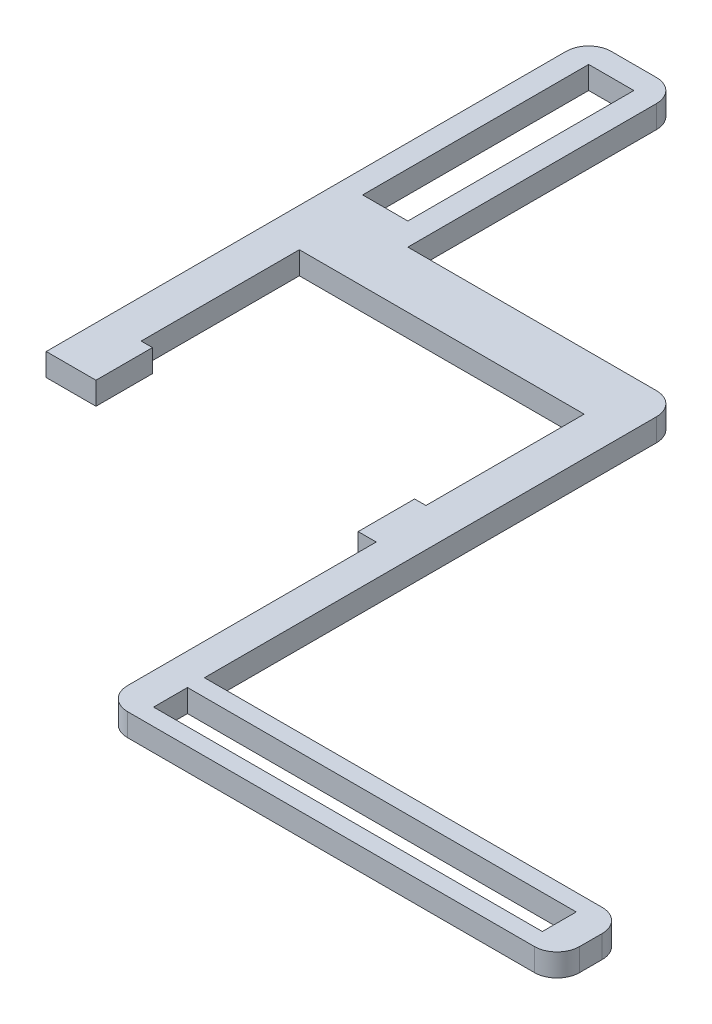
ISO-10303-21;
HEADER;
FILE_DESCRIPTION(('STEP AP214'),'2;1');
FILE_NAME('part.step','',(''),(''),'','','');
FILE_SCHEMA(('AUTOMOTIVE_DESIGN { 1 0 10303 214 1 1 1 1 }'));
ENDSEC;
DATA;
#1=APPLICATION_CONTEXT('core data for automotive mechanical design processes');
#2=APPLICATION_PROTOCOL_DEFINITION('international standard','automotive_design',2000,#1);
#3=PRODUCT_CONTEXT('',#1,'mechanical');
#4=PRODUCT('Part','Part','',(#3));
#5=PRODUCT_RELATED_PRODUCT_CATEGORY('part','',(#4));
#6=PRODUCT_DEFINITION_FORMATION('','',#4);
#7=PRODUCT_DEFINITION_CONTEXT('part definition',#1,'design');
#8=PRODUCT_DEFINITION('design','',#6,#7);
#9=PRODUCT_DEFINITION_SHAPE('','',#8);
#10=(LENGTH_UNIT() NAMED_UNIT(*) SI_UNIT(.MILLI.,.METRE.));
#11=(NAMED_UNIT(*) PLANE_ANGLE_UNIT() SI_UNIT($,.RADIAN.));
#12=(NAMED_UNIT(*) SI_UNIT($,.STERADIAN.) SOLID_ANGLE_UNIT());
#13=UNCERTAINTY_MEASURE_WITH_UNIT(LENGTH_MEASURE(1.E-05),#10,'distance_accuracy_value','');
#14=(GEOMETRIC_REPRESENTATION_CONTEXT(3) GLOBAL_UNCERTAINTY_ASSIGNED_CONTEXT((#13)) GLOBAL_UNIT_ASSIGNED_CONTEXT((#10,
#11,#12)) REPRESENTATION_CONTEXT('',''));
#15=CARTESIAN_POINT('',(0.,0.,0.));
#16=DIRECTION('',(0.,0.,1.));
#17=DIRECTION('',(1.,0.,0.));
#18=AXIS2_PLACEMENT_3D('',#15,#16,#17);
#19=CARTESIAN_POINT('',(0.,5.,-90.));
#20=DIRECTION('',(0.,0.,-1.));
#21=DIRECTION('',(-1.,0.,0.));
#22=AXIS2_PLACEMENT_3D('',#19,#20,#21);
#23=PLANE('',#22);
#24=DIRECTION('',(1.,0.,0.));
#25=VECTOR('',#24,1.);
#26=CARTESIAN_POINT('',(0.,5.,-90.));
#27=LINE('',#26,#25);
#28=CARTESIAN_POINT('',(-35.,5.,-90.));
#29=VERTEX_POINT('',#28);
#30=CARTESIAN_POINT('',(-25.,5.,-90.));
#31=VERTEX_POINT('',#30);
#32=EDGE_CURVE('E452',#29,#31,#27,.T.);
#33=ORIENTED_EDGE('',*,*,#32,.T.);
#34=DIRECTION('',(0.,-1.,0.));
#35=VECTOR('',#34,1.);
#36=CARTESIAN_POINT('',(-25.,0.,-90.));
#37=LINE('',#36,#35);
#38=CARTESIAN_POINT('',(-25.,0.,-90.));
#39=VERTEX_POINT('',#38);
#40=EDGE_CURVE('E636',#31,#39,#37,.T.);
#41=ORIENTED_EDGE('',*,*,#40,.T.);
#42=DIRECTION('',(1.,0.,0.));
#43=VECTOR('',#42,1.);
#44=CARTESIAN_POINT('',(0.,0.,-90.));
#45=LINE('',#44,#43);
#46=CARTESIAN_POINT('',(-35.,0.,-90.));
#47=VERTEX_POINT('',#46);
#48=EDGE_CURVE('E410',#47,#39,#45,.T.);
#49=ORIENTED_EDGE('',*,*,#48,.F.);
#50=DIRECTION('',(0.,-1.,0.));
#51=VECTOR('',#50,1.);
#52=CARTESIAN_POINT('',(-35.,5.,-90.));
#53=LINE('',#52,#51);
#54=EDGE_CURVE('E633',#47,#29,#53,.F.);
#55=ORIENTED_EDGE('',*,*,#54,.T.);
#56=EDGE_LOOP('',(#33,#41,#49,#55));
#57=FACE_BOUND('',#56,.T.);
#58=ADVANCED_FACE('F101',(#57),#23,.T.);
#59=CARTESIAN_POINT('',(-20.,5.,0.));
#60=DIRECTION('',(-1.,0.,0.));
#61=DIRECTION('',(0.,0.,1.));
#62=AXIS2_PLACEMENT_3D('',#59,#60,#61);
#63=PLANE('',#62);
#64=DIRECTION('',(0.,0.,-1.));
#65=VECTOR('',#64,1.);
#66=CARTESIAN_POINT('',(-20.,0.,0.));
#67=LINE('',#66,#65);
#68=CARTESIAN_POINT('',(-20.,0.,-30.));
#69=VERTEX_POINT('',#68);
#70=CARTESIAN_POINT('',(-20.,0.,-85.));
#71=VERTEX_POINT('',#70);
#72=EDGE_CURVE('E502',#69,#71,#67,.T.);
#73=ORIENTED_EDGE('',*,*,#72,.T.);
#74=DIRECTION('',(0.,-1.,0.));
#75=VECTOR('',#74,1.);
#76=CARTESIAN_POINT('',(-20.,5.,-85.));
#77=LINE('',#76,#75);
#78=CARTESIAN_POINT('',(-20.,5.,-85.));
#79=VERTEX_POINT('',#78);
#80=EDGE_CURVE('E110',#71,#79,#77,.F.);
#81=ORIENTED_EDGE('',*,*,#80,.T.);
#82=DIRECTION('',(0.,0.,-1.));
#83=VECTOR('',#82,1.);
#84=CARTESIAN_POINT('',(-20.,5.,0.));
#85=LINE('',#84,#83);
#86=CARTESIAN_POINT('',(-20.,5.,-30.));
#87=VERTEX_POINT('',#86);
#88=EDGE_CURVE('E448',#87,#79,#85,.T.);
#89=ORIENTED_EDGE('',*,*,#88,.F.);
#90=DIRECTION('',(0.,-1.,0.));
#91=VECTOR('',#90,1.);
#92=CARTESIAN_POINT('',(-20.,5.,-30.));
#93=LINE('',#92,#91);
#94=EDGE_CURVE('E456',#87,#69,#93,.T.);
#95=ORIENTED_EDGE('',*,*,#94,.T.);
#96=EDGE_LOOP('',(#73,#81,#89,#95));
#97=FACE_BOUND('',#96,.T.);
#98=ADVANCED_FACE('F643',(#97),#63,.F.);
#99=CARTESIAN_POINT('',(29.,5.,0.));
#100=DIRECTION('',(1.,0.,0.));
#101=DIRECTION('',(0.,0.,-1.));
#102=AXIS2_PLACEMENT_3D('',#99,#100,#101);
#103=PLANE('',#102);
#104=DIRECTION('',(0.,0.,1.));
#105=VECTOR('',#104,1.);
#106=CARTESIAN_POINT('',(29.,0.,0.));
#107=LINE('',#106,#105);
#108=CARTESIAN_POINT('',(29.,0.,17.5));
#109=VERTEX_POINT('',#108);
#110=CARTESIAN_POINT('',(29.,0.,30.));
#111=VERTEX_POINT('',#110);
#112=EDGE_CURVE('E487',#109,#111,#107,.T.);
#113=ORIENTED_EDGE('',*,*,#112,.T.);
#114=DIRECTION('',(0.,-1.,0.));
#115=VECTOR('',#114,1.);
#116=CARTESIAN_POINT('',(29.,5.,30.));
#117=LINE('',#116,#115);
#118=CARTESIAN_POINT('',(29.,5.,30.));
#119=VERTEX_POINT('',#118);
#120=EDGE_CURVE('E518',#119,#111,#117,.T.);
#121=ORIENTED_EDGE('',*,*,#120,.F.);
#122=DIRECTION('',(0.,0.,1.));
#123=VECTOR('',#122,1.);
#124=CARTESIAN_POINT('',(29.,5.,0.));
#125=LINE('',#124,#123);
#126=CARTESIAN_POINT('',(29.,5.,17.5));
#127=VERTEX_POINT('',#126);
#128=EDGE_CURVE('E433',#127,#119,#125,.T.);
#129=ORIENTED_EDGE('',*,*,#128,.F.);
#130=DIRECTION('',(0.,-1.,0.));
#131=VECTOR('',#130,1.);
#132=CARTESIAN_POINT('',(29.,5.,17.5));
#133=LINE('',#132,#131);
#134=EDGE_CURVE('E522',#127,#109,#133,.T.);
#135=ORIENTED_EDGE('',*,*,#134,.T.);
#136=EDGE_LOOP('',(#113,#121,#129,#135));
#137=FACE_BOUND('',#136,.T.);
#138=ADVANCED_FACE('F707',(#137),#103,.F.);
#139=CARTESIAN_POINT('',(0.,5.,17.5));
#140=DIRECTION('',(0.,0.,-1.));
#141=DIRECTION('',(-1.,0.,0.));
#142=AXIS2_PLACEMENT_3D('',#139,#140,#141);
#143=PLANE('',#142);
#144=DIRECTION('',(1.,0.,0.));
#145=VECTOR('',#144,1.);
#146=CARTESIAN_POINT('',(0.,0.,17.5));
#147=LINE('',#146,#145);
#148=CARTESIAN_POINT('',(31.5,0.,17.5));
#149=VERTEX_POINT('',#148);
#150=EDGE_CURVE('E476',#109,#149,#147,.T.);
#151=ORIENTED_EDGE('',*,*,#150,.F.);
#152=ORIENTED_EDGE('',*,*,#134,.F.);
#153=DIRECTION('',(1.,0.,0.));
#154=VECTOR('',#153,1.);
#155=CARTESIAN_POINT('',(0.,5.,17.5));
#156=LINE('',#155,#154);
#157=CARTESIAN_POINT('',(31.5,5.,17.5));
#158=VERTEX_POINT('',#157);
#159=EDGE_CURVE('E423',#127,#158,#156,.T.);
#160=ORIENTED_EDGE('',*,*,#159,.T.);
#161=DIRECTION('',(0.,-1.,0.));
#162=VECTOR('',#161,1.);
#163=CARTESIAN_POINT('',(31.5,5.,17.5));
#164=LINE('',#163,#162);
#165=EDGE_CURVE('E525',#158,#149,#164,.T.);
#166=ORIENTED_EDGE('',*,*,#165,.T.);
#167=EDGE_LOOP('',(#151,#152,#160,#166));
#168=FACE_BOUND('',#167,.T.);
#169=ADVANCED_FACE('F695',(#168),#143,.T.);
#170=CARTESIAN_POINT('',(31.5,5.,0.));
#171=DIRECTION('',(-1.,0.,0.));
#172=DIRECTION('',(0.,0.,1.));
#173=AXIS2_PLACEMENT_3D('',#170,#171,#172);
#174=PLANE('',#173);
#175=DIRECTION('',(0.,0.,-1.));
#176=VECTOR('',#175,1.);
#177=CARTESIAN_POINT('',(31.5,0.,0.));
#178=LINE('',#177,#176);
#179=CARTESIAN_POINT('',(31.5,0.,-17.5));
#180=VERTEX_POINT('',#179);
#181=EDGE_CURVE('E483',#149,#180,#178,.T.);
#182=ORIENTED_EDGE('',*,*,#181,.F.);
#183=ORIENTED_EDGE('',*,*,#165,.F.);
#184=DIRECTION('',(0.,0.,-1.));
#185=VECTOR('',#184,1.);
#186=CARTESIAN_POINT('',(31.5,5.,0.));
#187=LINE('',#186,#185);
#188=CARTESIAN_POINT('',(31.5,5.,-17.5));
#189=VERTEX_POINT('',#188);
#190=EDGE_CURVE('E429',#158,#189,#187,.T.);
#191=ORIENTED_EDGE('',*,*,#190,.T.);
#192=DIRECTION('',(0.,-1.,0.));
#193=VECTOR('',#192,1.);
#194=CARTESIAN_POINT('',(31.5,5.,-17.5));
#195=LINE('',#194,#193);
#196=EDGE_CURVE('E528',#189,#180,#195,.T.);
#197=ORIENTED_EDGE('',*,*,#196,.T.);
#198=EDGE_LOOP('',(#182,#183,#191,#197));
#199=FACE_BOUND('',#198,.T.);
#200=ADVANCED_FACE('F690',(#199),#174,.T.);
#201=CARTESIAN_POINT('',(0.,5.,-17.5));
#202=DIRECTION('',(0.,0.,-1.));
#203=DIRECTION('',(-1.,0.,0.));
#204=AXIS2_PLACEMENT_3D('',#201,#202,#203);
#205=PLANE('',#204);
#206=DIRECTION('',(1.,0.,0.));
#207=VECTOR('',#206,1.);
#208=CARTESIAN_POINT('',(0.,0.,-17.5));
#209=LINE('',#208,#207);
#210=CARTESIAN_POINT('',(-31.5,0.,-17.5));
#211=VERTEX_POINT('',#210);
#212=EDGE_CURVE('E479',#211,#180,#209,.T.);
#213=ORIENTED_EDGE('',*,*,#212,.T.);
#214=ORIENTED_EDGE('',*,*,#196,.F.);
#215=DIRECTION('',(1.,0.,0.));
#216=VECTOR('',#215,1.);
#217=CARTESIAN_POINT('',(0.,5.,-17.5));
#218=LINE('',#217,#216);
#219=CARTESIAN_POINT('',(-31.5,5.,-17.5));
#220=VERTEX_POINT('',#219);
#221=EDGE_CURVE('E426',#220,#189,#218,.T.);
#222=ORIENTED_EDGE('',*,*,#221,.F.);
#223=DIRECTION('',(0.,-1.,0.));
#224=VECTOR('',#223,1.);
#225=CARTESIAN_POINT('',(-31.5,5.,-17.5));
#226=LINE('',#225,#224);
#227=EDGE_CURVE('E531',#220,#211,#226,.T.);
#228=ORIENTED_EDGE('',*,*,#227,.T.);
#229=EDGE_LOOP('',(#213,#214,#222,#228));
#230=FACE_BOUND('',#229,.T.);
#231=ADVANCED_FACE('F687',(#230),#205,.F.);
#232=CARTESIAN_POINT('',(-31.5,5.,0.));
#233=DIRECTION('',(-1.,0.,0.));
#234=DIRECTION('',(0.,0.,1.));
#235=AXIS2_PLACEMENT_3D('',#232,#233,#234);
#236=PLANE('',#235);
#237=DIRECTION('',(0.,0.,-1.));
#238=VECTOR('',#237,1.);
#239=CARTESIAN_POINT('',(-31.5,0.,0.));
#240=LINE('',#239,#238);
#241=CARTESIAN_POINT('',(-31.5,0.,17.5));
#242=VERTEX_POINT('',#241);
#243=EDGE_CURVE('E475',#242,#211,#240,.T.);
#244=ORIENTED_EDGE('',*,*,#243,.T.);
#245=ORIENTED_EDGE('',*,*,#227,.F.);
#246=DIRECTION('',(0.,0.,-1.));
#247=VECTOR('',#246,1.);
#248=CARTESIAN_POINT('',(-31.5,5.,0.));
#249=LINE('',#248,#247);
#250=CARTESIAN_POINT('',(-31.5,5.,17.5));
#251=VERTEX_POINT('',#250);
#252=EDGE_CURVE('E422',#251,#220,#249,.T.);
#253=ORIENTED_EDGE('',*,*,#252,.F.);
#254=DIRECTION('',(0.,-1.,0.));
#255=VECTOR('',#254,1.);
#256=CARTESIAN_POINT('',(-31.5,5.,17.5));
#257=LINE('',#256,#255);
#258=EDGE_CURVE('E535',#251,#242,#257,.T.);
#259=ORIENTED_EDGE('',*,*,#258,.T.);
#260=EDGE_LOOP('',(#244,#245,#253,#259));
#261=FACE_BOUND('',#260,.T.);
#262=ADVANCED_FACE('F683',(#261),#236,.F.);
#263=CARTESIAN_POINT('',(-29.,0.,17.5));
#264=VERTEX_POINT('',#263);
#265=EDGE_CURVE('E471',#242,#264,#147,.T.);
#266=ORIENTED_EDGE('',*,*,#265,.F.);
#267=ORIENTED_EDGE('',*,*,#258,.F.);
#268=CARTESIAN_POINT('',(-29.,5.,17.5));
#269=VERTEX_POINT('',#268);
#270=EDGE_CURVE('E418',#251,#269,#156,.T.);
#271=ORIENTED_EDGE('',*,*,#270,.T.);
#272=DIRECTION('',(0.,-1.,0.));
#273=VECTOR('',#272,1.);
#274=CARTESIAN_POINT('',(-29.,5.,17.5));
#275=LINE('',#274,#273);
#276=EDGE_CURVE('E538',#269,#264,#275,.T.);
#277=ORIENTED_EDGE('',*,*,#276,.T.);
#278=EDGE_LOOP('',(#266,#267,#271,#277));
#279=FACE_BOUND('',#278,.T.);
#280=ADVANCED_FACE('F676',(#279),#143,.T.);
#281=CARTESIAN_POINT('',(-29.,5.,0.));
#282=DIRECTION('',(1.,0.,0.));
#283=DIRECTION('',(0.,0.,-1.));
#284=AXIS2_PLACEMENT_3D('',#281,#282,#283);
#285=PLANE('',#284);
#286=DIRECTION('',(0.,0.,1.));
#287=VECTOR('',#286,1.);
#288=CARTESIAN_POINT('',(-29.,0.,0.));
#289=LINE('',#288,#287);
#290=CARTESIAN_POINT('',(-29.,0.,30.));
#291=VERTEX_POINT('',#290);
#292=EDGE_CURVE('E466',#264,#291,#289,.T.);
#293=ORIENTED_EDGE('',*,*,#292,.F.);
#294=ORIENTED_EDGE('',*,*,#276,.F.);
#295=DIRECTION('',(0.,0.,1.));
#296=VECTOR('',#295,1.);
#297=CARTESIAN_POINT('',(-29.,5.,0.));
#298=LINE('',#297,#296);
#299=CARTESIAN_POINT('',(-29.,5.,30.));
#300=VERTEX_POINT('',#299);
#301=EDGE_CURVE('E413',#269,#300,#298,.T.);
#302=ORIENTED_EDGE('',*,*,#301,.T.);
#303=DIRECTION('',(0.,-1.,0.));
#304=VECTOR('',#303,1.);
#305=CARTESIAN_POINT('',(-29.,5.,30.));
#306=LINE('',#305,#304);
#307=EDGE_CURVE('E541',#300,#291,#306,.T.);
#308=ORIENTED_EDGE('',*,*,#307,.T.);
#309=EDGE_LOOP('',(#293,#294,#302,#308));
#310=FACE_BOUND('',#309,.T.);
#311=ADVANCED_FACE('F673',(#310),#285,.T.);
#312=CARTESIAN_POINT('',(0.,5.,30.));
#313=DIRECTION('',(0.,0.,-1.));
#314=DIRECTION('',(-1.,0.,0.));
#315=AXIS2_PLACEMENT_3D('',#312,#313,#314);
#316=PLANE('',#315);
#317=DIRECTION('',(1.,0.,0.));
#318=VECTOR('',#317,1.);
#319=CARTESIAN_POINT('',(0.,0.,30.));
#320=LINE('',#319,#318);
#321=CARTESIAN_POINT('',(-40.,0.,30.));
#322=VERTEX_POINT('',#321);
#323=EDGE_CURVE('E461',#322,#291,#320,.T.);
#324=ORIENTED_EDGE('',*,*,#323,.T.);
#325=ORIENTED_EDGE('',*,*,#307,.F.);
#326=DIRECTION('',(1.,0.,0.));
#327=VECTOR('',#326,1.);
#328=CARTESIAN_POINT('',(0.,5.,30.));
#329=LINE('',#328,#327);
#330=CARTESIAN_POINT('',(-40.,5.,30.));
#331=VERTEX_POINT('',#330);
#332=EDGE_CURVE('E409',#331,#300,#329,.T.);
#333=ORIENTED_EDGE('',*,*,#332,.F.);
#334=DIRECTION('',(0.,-1.,0.));
#335=VECTOR('',#334,1.);
#336=CARTESIAN_POINT('',(-40.,5.,30.));
#337=LINE('',#336,#335);
#338=EDGE_CURVE('E544',#331,#322,#337,.T.);
#339=ORIENTED_EDGE('',*,*,#338,.T.);
#340=EDGE_LOOP('',(#324,#325,#333,#339));
#341=FACE_BOUND('',#340,.T.);
#342=ADVANCED_FACE('F670',(#341),#316,.F.);
#343=CARTESIAN_POINT('',(-40.,5.,0.));
#344=DIRECTION('',(-1.,0.,0.));
#345=DIRECTION('',(0.,0.,1.));
#346=AXIS2_PLACEMENT_3D('',#343,#344,#345);
#347=PLANE('',#346);
#348=DIRECTION('',(0.,0.,-1.));
#349=VECTOR('',#348,1.);
#350=CARTESIAN_POINT('',(-40.,5.,0.));
#351=LINE('',#350,#349);
#352=CARTESIAN_POINT('',(-40.,5.,-85.));
#353=VERTEX_POINT('',#352);
#354=EDGE_CURVE('E405',#331,#353,#351,.T.);
#355=ORIENTED_EDGE('',*,*,#354,.T.);
#356=DIRECTION('',(0.,-1.,0.));
#357=VECTOR('',#356,1.);
#358=CARTESIAN_POINT('',(-40.,5.,-85.));
#359=LINE('',#358,#357);
#360=CARTESIAN_POINT('',(-40.,0.,-85.));
#361=VERTEX_POINT('',#360);
#362=EDGE_CURVE('E12',#353,#361,#359,.T.);
#363=ORIENTED_EDGE('',*,*,#362,.T.);
#364=DIRECTION('',(0.,0.,-1.));
#365=VECTOR('',#364,1.);
#366=CARTESIAN_POINT('',(-40.,0.,0.));
#367=LINE('',#366,#365);
#368=EDGE_CURVE('E457',#322,#361,#367,.T.);
#369=ORIENTED_EDGE('',*,*,#368,.F.);
#370=ORIENTED_EDGE('',*,*,#338,.F.);
#371=EDGE_LOOP('',(#355,#363,#369,#370));
#372=FACE_BOUND('',#371,.T.);
#373=ADVANCED_FACE('F663',(#372),#347,.T.);
#374=CARTESIAN_POINT('',(33.,0.,30.));
#375=VERTEX_POINT('',#374);
#376=EDGE_CURVE('E467',#111,#375,#320,.T.);
#377=ORIENTED_EDGE('',*,*,#376,.T.);
#378=DIRECTION('',(0.,-1.,0.));
#379=VECTOR('',#378,1.);
#380=CARTESIAN_POINT('',(33.,5.,30.));
#381=LINE('',#380,#379);
#382=CARTESIAN_POINT('',(33.,5.,30.));
#383=VERTEX_POINT('',#382);
#384=EDGE_CURVE('E514',#383,#375,#381,.T.);
#385=ORIENTED_EDGE('',*,*,#384,.F.);
#386=EDGE_CURVE('E414',#119,#383,#329,.T.);
#387=ORIENTED_EDGE('',*,*,#386,.F.);
#388=ORIENTED_EDGE('',*,*,#120,.T.);
#389=EDGE_LOOP('',(#377,#385,#387,#388));
#390=FACE_BOUND('',#389,.T.);
#391=ADVANCED_FACE('F710',(#390),#316,.F.);
#392=CARTESIAN_POINT('',(0.,5.,0.));
#393=DIRECTION('',(0.,1.,0.));
#394=DIRECTION('',(0.,0.,1.));
#395=AXIS2_PLACEMENT_3D('',#392,#393,#394);
#396=PLANE('',#395);
#397=DIRECTION('',(0.,0.,-1.));
#398=VECTOR('',#397,1.);
#399=CARTESIAN_POINT('',(126.,5.,86.25));
#400=LINE('',#399,#398);
#401=CARTESIAN_POINT('',(126.,5.,86.25));
#402=VERTEX_POINT('',#401);
#403=CARTESIAN_POINT('',(126.,5.,78.75));
#404=VERTEX_POINT('',#403);
#405=EDGE_CURVE('E117',#402,#404,#400,.T.);
#406=ORIENTED_EDGE('',*,*,#405,.F.);
#407=DIRECTION('',(1.,0.,0.));
#408=VECTOR('',#407,1.);
#409=CARTESIAN_POINT('',(40.,5.,86.25));
#410=LINE('',#409,#408);
#411=CARTESIAN_POINT('',(40.,5.,86.25));
#412=VERTEX_POINT('',#411);
#413=EDGE_CURVE('E335',#412,#402,#410,.T.);
#414=ORIENTED_EDGE('',*,*,#413,.F.);
#415=DIRECTION('',(0.,0.,1.));
#416=VECTOR('',#415,1.);
#417=CARTESIAN_POINT('',(40.,5.,86.25));
#418=LINE('',#417,#416);
#419=CARTESIAN_POINT('',(40.,5.,78.75));
#420=VERTEX_POINT('',#419);
#421=EDGE_CURVE('E339',#420,#412,#418,.T.);
#422=ORIENTED_EDGE('',*,*,#421,.F.);
#423=DIRECTION('',(-1.,0.,0.));
#424=VECTOR('',#423,1.);
#425=CARTESIAN_POINT('',(40.,5.,78.75));
#426=LINE('',#425,#424);
#427=EDGE_CURVE('E348',#404,#420,#426,.T.);
#428=ORIENTED_EDGE('',*,*,#427,.F.);
#429=EDGE_LOOP('',(#406,#414,#422,#428));
#430=FACE_BOUND('',#429,.T.);
#431=DIRECTION('',(0.,0.,-1.));
#432=VECTOR('',#431,1.);
#433=CARTESIAN_POINT('',(-25.,5.,-35.));
#434=LINE('',#433,#432);
#435=CARTESIAN_POINT('',(-25.,5.,-35.));
#436=VERTEX_POINT('',#435);
#437=CARTESIAN_POINT('',(-25.,5.,-85.));
#438=VERTEX_POINT('',#437);
#439=EDGE_CURVE('E125',#436,#438,#434,.T.);
#440=ORIENTED_EDGE('',*,*,#439,.F.);
#441=DIRECTION('',(1.,0.,0.));
#442=VECTOR('',#441,1.);
#443=CARTESIAN_POINT('',(-35.,5.,-35.));
#444=LINE('',#443,#442);
#445=CARTESIAN_POINT('',(-35.,5.,-35.));
#446=VERTEX_POINT('',#445);
#447=EDGE_CURVE('E369',#446,#436,#444,.T.);
#448=ORIENTED_EDGE('',*,*,#447,.F.);
#449=DIRECTION('',(0.,0.,1.));
#450=VECTOR('',#449,1.);
#451=CARTESIAN_POINT('',(-35.,5.,-35.));
#452=LINE('',#451,#450);
#453=CARTESIAN_POINT('',(-35.,5.,-85.));
#454=VERTEX_POINT('',#453);
#455=EDGE_CURVE('E388',#454,#446,#452,.T.);
#456=ORIENTED_EDGE('',*,*,#455,.F.);
#457=DIRECTION('',(-1.,0.,0.));
#458=VECTOR('',#457,1.);
#459=CARTESIAN_POINT('',(-35.,5.,-85.));
#460=LINE('',#459,#458);
#461=EDGE_CURVE('E384',#438,#454,#460,.T.);
#462=ORIENTED_EDGE('',*,*,#461,.F.);
#463=EDGE_LOOP('',(#440,#448,#456,#462));
#464=FACE_BOUND('',#463,.T.);
#465=DIRECTION('',(0.,0.,-1.));
#466=VECTOR('',#465,1.);
#467=CARTESIAN_POINT('',(40.,5.,0.));
#468=LINE('',#467,#466);
#469=CARTESIAN_POINT('',(40.,5.,75.));
#470=VERTEX_POINT('',#469);
#471=CARTESIAN_POINT('',(40.,5.,-25.));
#472=VERTEX_POINT('',#471);
#473=EDGE_CURVE('E440',#470,#472,#468,.T.);
#474=ORIENTED_EDGE('',*,*,#473,.T.);
#475=CARTESIAN_POINT('',(35.,5.,-25.));
#476=DIRECTION('',(0.,1.,0.));
#477=DIRECTION('',(0.,0.,1.));
#478=AXIS2_PLACEMENT_3D('',#475,#476,#477);
#479=CIRCLE('',#478,5.);
#480=CARTESIAN_POINT('',(35.,5.,-30.));
#481=VERTEX_POINT('',#480);
#482=EDGE_CURVE('E609',#472,#481,#479,.T.);
#483=ORIENTED_EDGE('',*,*,#482,.T.);
#484=DIRECTION('',(1.,0.,0.));
#485=VECTOR('',#484,1.);
#486=CARTESIAN_POINT('',(0.,5.,-30.));
#487=LINE('',#486,#485);
#488=EDGE_CURVE('E444',#87,#481,#487,.T.);
#489=ORIENTED_EDGE('',*,*,#488,.F.);
#490=ORIENTED_EDGE('',*,*,#88,.T.);
#491=CARTESIAN_POINT('',(-25.,5.,-85.));
#492=DIRECTION('',(0.,1.,0.));
#493=DIRECTION('',(0.,0.,1.));
#494=AXIS2_PLACEMENT_3D('',#491,#492,#493);
#495=CIRCLE('',#494,5.);
#496=EDGE_CURVE('E597',#79,#31,#495,.T.);
#497=ORIENTED_EDGE('',*,*,#496,.T.);
#498=ORIENTED_EDGE('',*,*,#32,.F.);
#499=CARTESIAN_POINT('',(-35.,5.,-85.));
#500=DIRECTION('',(0.,1.,0.));
#501=DIRECTION('',(0.,0.,1.));
#502=AXIS2_PLACEMENT_3D('',#499,#500,#501);
#503=CIRCLE('',#502,5.);
#504=EDGE_CURVE('E594',#29,#353,#503,.T.);
#505=ORIENTED_EDGE('',*,*,#504,.T.);
#506=ORIENTED_EDGE('',*,*,#354,.F.);
#507=ORIENTED_EDGE('',*,*,#332,.T.);
#508=ORIENTED_EDGE('',*,*,#301,.F.);
#509=ORIENTED_EDGE('',*,*,#270,.F.);
#510=ORIENTED_EDGE('',*,*,#252,.T.);
#511=ORIENTED_EDGE('',*,*,#221,.T.);
#512=ORIENTED_EDGE('',*,*,#190,.F.);
#513=ORIENTED_EDGE('',*,*,#159,.F.);
#514=ORIENTED_EDGE('',*,*,#128,.T.);
#515=ORIENTED_EDGE('',*,*,#386,.T.);
#516=DIRECTION('',(0.,0.,1.));
#517=VECTOR('',#516,1.);
#518=CARTESIAN_POINT('',(33.,5.,0.));
#519=LINE('',#518,#517);
#520=CARTESIAN_POINT('',(33.,5.,85.));
#521=VERTEX_POINT('',#520);
#522=EDGE_CURVE('E436',#383,#521,#519,.T.);
#523=ORIENTED_EDGE('',*,*,#522,.T.);
#524=CARTESIAN_POINT('',(38.,5.,85.));
#525=DIRECTION('',(0.,1.,0.));
#526=DIRECTION('',(0.,0.,1.));
#527=AXIS2_PLACEMENT_3D('',#524,#525,#526);
#528=CIRCLE('',#527,5.);
#529=CARTESIAN_POINT('',(38.,5.,90.));
#530=VERTEX_POINT('',#529);
#531=EDGE_CURVE('E600',#521,#530,#528,.T.);
#532=ORIENTED_EDGE('',*,*,#531,.T.);
#533=DIRECTION('',(1.,0.,0.));
#534=VECTOR('',#533,1.);
#535=CARTESIAN_POINT('',(33.,5.,90.));
#536=LINE('',#535,#534);
#537=CARTESIAN_POINT('',(128.,5.,90.));
#538=VERTEX_POINT('',#537);
#539=EDGE_CURVE('E548',#530,#538,#536,.T.);
#540=ORIENTED_EDGE('',*,*,#539,.T.);
#541=CARTESIAN_POINT('',(128.,5.,85.));
#542=DIRECTION('',(0.,1.,0.));
#543=DIRECTION('',(0.,0.,1.));
#544=AXIS2_PLACEMENT_3D('',#541,#542,#543);
#545=CIRCLE('',#544,5.);
#546=CARTESIAN_POINT('',(133.,5.,85.));
#547=VERTEX_POINT('',#546);
#548=EDGE_CURVE('E606',#538,#547,#545,.T.);
#549=ORIENTED_EDGE('',*,*,#548,.T.);
#550=DIRECTION('',(0.,0.,1.));
#551=VECTOR('',#550,1.);
#552=CARTESIAN_POINT('',(133.,5.,75.));
#553=LINE('',#552,#551);
#554=CARTESIAN_POINT('',(133.,5.,80.));
#555=VERTEX_POINT('',#554);
#556=EDGE_CURVE('E552',#555,#547,#553,.T.);
#557=ORIENTED_EDGE('',*,*,#556,.F.);
#558=CARTESIAN_POINT('',(128.,5.,80.));
#559=DIRECTION('',(0.,1.,0.));
#560=DIRECTION('',(0.,0.,1.));
#561=AXIS2_PLACEMENT_3D('',#558,#559,#560);
#562=CIRCLE('',#561,5.);
#563=CARTESIAN_POINT('',(128.,5.,75.));
#564=VERTEX_POINT('',#563);
#565=EDGE_CURVE('E603',#555,#564,#562,.T.);
#566=ORIENTED_EDGE('',*,*,#565,.T.);
#567=DIRECTION('',(1.,0.,0.));
#568=VECTOR('',#567,1.);
#569=CARTESIAN_POINT('',(33.,5.,75.));
#570=LINE('',#569,#568);
#571=EDGE_CURVE('E462',#470,#564,#570,.T.);
#572=ORIENTED_EDGE('',*,*,#571,.F.);
#573=EDGE_LOOP('',(#474,#483,#489,#490,#497,#498,#505,#506,#507,#508,#509,#510,#511,#512,#513,
#514,#515,#523,#532,#540,#549,#557,#566,#572));
#574=FACE_BOUND('',#573,.T.);
#575=ADVANCED_FACE('F649',(#430,#464,#574),#396,.T.);
#576=CARTESIAN_POINT('',(0.,5.,-30.));
#577=DIRECTION('',(0.,0.,-1.));
#578=DIRECTION('',(-1.,0.,0.));
#579=AXIS2_PLACEMENT_3D('',#576,#577,#578);
#580=PLANE('',#579);
#581=ORIENTED_EDGE('',*,*,#488,.T.);
#582=DIRECTION('',(0.,-1.,0.));
#583=VECTOR('',#582,1.);
#584=CARTESIAN_POINT('',(35.,0.,-30.));
#585=LINE('',#584,#583);
#586=CARTESIAN_POINT('',(35.,0.,-30.));
#587=VERTEX_POINT('',#586);
#588=EDGE_CURVE('E547',#481,#587,#585,.T.);
#589=ORIENTED_EDGE('',*,*,#588,.T.);
#590=DIRECTION('',(1.,0.,0.));
#591=VECTOR('',#590,1.);
#592=CARTESIAN_POINT('',(0.,0.,-30.));
#593=LINE('',#592,#591);
#594=EDGE_CURVE('E498',#69,#587,#593,.T.);
#595=ORIENTED_EDGE('',*,*,#594,.F.);
#596=ORIENTED_EDGE('',*,*,#94,.F.);
#597=EDGE_LOOP('',(#581,#589,#595,#596));
#598=FACE_BOUND('',#597,.T.);
#599=ADVANCED_FACE('F751',(#598),#580,.T.);
#600=CARTESIAN_POINT('',(0.,0.,0.));
#601=DIRECTION('',(0.,1.,0.));
#602=DIRECTION('',(0.,0.,1.));
#603=AXIS2_PLACEMENT_3D('',#600,#601,#602);
#604=PLANE('',#603);
#605=DIRECTION('',(1.,0.,0.));
#606=VECTOR('',#605,1.);
#607=CARTESIAN_POINT('',(40.,0.,86.25));
#608=LINE('',#607,#606);
#609=CARTESIAN_POINT('',(40.,0.,86.25));
#610=VERTEX_POINT('',#609);
#611=CARTESIAN_POINT('',(126.,0.,86.25));
#612=VERTEX_POINT('',#611);
#613=EDGE_CURVE('E320',#610,#612,#608,.T.);
#614=ORIENTED_EDGE('',*,*,#613,.T.);
#615=DIRECTION('',(0.,0.,-1.));
#616=VECTOR('',#615,1.);
#617=CARTESIAN_POINT('',(126.,0.,86.25));
#618=LINE('',#617,#616);
#619=CARTESIAN_POINT('',(126.,0.,78.75));
#620=VERTEX_POINT('',#619);
#621=EDGE_CURVE('E313',#612,#620,#618,.T.);
#622=ORIENTED_EDGE('',*,*,#621,.T.);
#623=DIRECTION('',(-1.,0.,0.));
#624=VECTOR('',#623,1.);
#625=CARTESIAN_POINT('',(40.,0.,78.75));
#626=LINE('',#625,#624);
#627=CARTESIAN_POINT('',(40.,0.,78.75));
#628=VERTEX_POINT('',#627);
#629=EDGE_CURVE('E324',#620,#628,#626,.T.);
#630=ORIENTED_EDGE('',*,*,#629,.T.);
#631=DIRECTION('',(0.,0.,1.));
#632=VECTOR('',#631,1.);
#633=CARTESIAN_POINT('',(40.,0.,86.25));
#634=LINE('',#633,#632);
#635=EDGE_CURVE('E329',#628,#610,#634,.T.);
#636=ORIENTED_EDGE('',*,*,#635,.T.);
#637=EDGE_LOOP('',(#614,#622,#630,#636));
#638=FACE_BOUND('',#637,.T.);
#639=DIRECTION('',(1.,0.,0.));
#640=VECTOR('',#639,1.);
#641=CARTESIAN_POINT('',(-35.,0.,-35.));
#642=LINE('',#641,#640);
#643=CARTESIAN_POINT('',(-35.,0.,-35.));
#644=VERTEX_POINT('',#643);
#645=CARTESIAN_POINT('',(-25.,0.,-35.));
#646=VERTEX_POINT('',#645);
#647=EDGE_CURVE('E377',#644,#646,#642,.T.);
#648=ORIENTED_EDGE('',*,*,#647,.T.);
#649=DIRECTION('',(0.,0.,-1.));
#650=VECTOR('',#649,1.);
#651=CARTESIAN_POINT('',(-25.,0.,-35.));
#652=LINE('',#651,#650);
#653=CARTESIAN_POINT('',(-25.,0.,-85.));
#654=VERTEX_POINT('',#653);
#655=EDGE_CURVE('E364',#646,#654,#652,.T.);
#656=ORIENTED_EDGE('',*,*,#655,.T.);
#657=DIRECTION('',(-1.,0.,0.));
#658=VECTOR('',#657,1.);
#659=CARTESIAN_POINT('',(-35.,0.,-85.));
#660=LINE('',#659,#658);
#661=CARTESIAN_POINT('',(-35.,0.,-85.));
#662=VERTEX_POINT('',#661);
#663=EDGE_CURVE('E368',#654,#662,#660,.T.);
#664=ORIENTED_EDGE('',*,*,#663,.T.);
#665=DIRECTION('',(0.,0.,1.));
#666=VECTOR('',#665,1.);
#667=CARTESIAN_POINT('',(-35.,0.,-35.));
#668=LINE('',#667,#666);
#669=EDGE_CURVE('E373',#662,#644,#668,.T.);
#670=ORIENTED_EDGE('',*,*,#669,.T.);
#671=EDGE_LOOP('',(#648,#656,#664,#670));
#672=FACE_BOUND('',#671,.T.);
#673=ORIENTED_EDGE('',*,*,#594,.T.);
#674=CARTESIAN_POINT('',(35.,0.,-25.));
#675=DIRECTION('',(0.,1.,0.));
#676=DIRECTION('',(0.,0.,1.));
#677=AXIS2_PLACEMENT_3D('',#674,#675,#676);
#678=CIRCLE('',#677,5.);
#679=CARTESIAN_POINT('',(40.,0.,-25.));
#680=VERTEX_POINT('',#679);
#681=EDGE_CURVE('E588',#587,#680,#678,.F.);
#682=ORIENTED_EDGE('',*,*,#681,.T.);
#683=DIRECTION('',(0.,0.,-1.));
#684=VECTOR('',#683,1.);
#685=CARTESIAN_POINT('',(40.,0.,0.));
#686=LINE('',#685,#684);
#687=CARTESIAN_POINT('',(40.,0.,75.));
#688=VERTEX_POINT('',#687);
#689=EDGE_CURVE('E494',#688,#680,#686,.T.);
#690=ORIENTED_EDGE('',*,*,#689,.F.);
#691=DIRECTION('',(1.,0.,0.));
#692=VECTOR('',#691,1.);
#693=CARTESIAN_POINT('',(33.,0.,75.));
#694=LINE('',#693,#692);
#695=CARTESIAN_POINT('',(128.,0.,75.));
#696=VERTEX_POINT('',#695);
#697=EDGE_CURVE('E553',#688,#696,#694,.T.);
#698=ORIENTED_EDGE('',*,*,#697,.T.);
#699=CARTESIAN_POINT('',(128.,0.,80.));
#700=DIRECTION('',(0.,1.,0.));
#701=DIRECTION('',(0.,0.,1.));
#702=AXIS2_PLACEMENT_3D('',#699,#700,#701);
#703=CIRCLE('',#702,5.);
#704=CARTESIAN_POINT('',(133.,0.,80.));
#705=VERTEX_POINT('',#704);
#706=EDGE_CURVE('E582',#696,#705,#703,.F.);
#707=ORIENTED_EDGE('',*,*,#706,.T.);
#708=DIRECTION('',(0.,0.,1.));
#709=VECTOR('',#708,1.);
#710=CARTESIAN_POINT('',(133.,0.,75.));
#711=LINE('',#710,#709);
#712=CARTESIAN_POINT('',(133.,0.,85.));
#713=VERTEX_POINT('',#712);
#714=EDGE_CURVE('E563',#705,#713,#711,.T.);
#715=ORIENTED_EDGE('',*,*,#714,.T.);
#716=CARTESIAN_POINT('',(128.,0.,85.));
#717=DIRECTION('',(0.,1.,0.));
#718=DIRECTION('',(0.,0.,1.));
#719=AXIS2_PLACEMENT_3D('',#716,#717,#718);
#720=CIRCLE('',#719,5.);
#721=CARTESIAN_POINT('',(128.,0.,90.));
#722=VERTEX_POINT('',#721);
#723=EDGE_CURVE('E585',#713,#722,#720,.F.);
#724=ORIENTED_EDGE('',*,*,#723,.T.);
#725=DIRECTION('',(1.,0.,0.));
#726=VECTOR('',#725,1.);
#727=CARTESIAN_POINT('',(33.,0.,90.));
#728=LINE('',#727,#726);
#729=CARTESIAN_POINT('',(38.,0.,90.));
#730=VERTEX_POINT('',#729);
#731=EDGE_CURVE('E358',#730,#722,#728,.T.);
#732=ORIENTED_EDGE('',*,*,#731,.F.);
#733=CARTESIAN_POINT('',(38.,0.,85.));
#734=DIRECTION('',(0.,1.,0.));
#735=DIRECTION('',(0.,0.,1.));
#736=AXIS2_PLACEMENT_3D('',#733,#734,#735);
#737=CIRCLE('',#736,5.);
#738=CARTESIAN_POINT('',(33.,0.,85.));
#739=VERTEX_POINT('',#738);
#740=EDGE_CURVE('E579',#730,#739,#737,.F.);
#741=ORIENTED_EDGE('',*,*,#740,.T.);
#742=DIRECTION('',(0.,0.,1.));
#743=VECTOR('',#742,1.);
#744=CARTESIAN_POINT('',(33.,0.,0.));
#745=LINE('',#744,#743);
#746=EDGE_CURVE('E490',#375,#739,#745,.T.);
#747=ORIENTED_EDGE('',*,*,#746,.F.);
#748=ORIENTED_EDGE('',*,*,#376,.F.);
#749=ORIENTED_EDGE('',*,*,#112,.F.);
#750=ORIENTED_EDGE('',*,*,#150,.T.);
#751=ORIENTED_EDGE('',*,*,#181,.T.);
#752=ORIENTED_EDGE('',*,*,#212,.F.);
#753=ORIENTED_EDGE('',*,*,#243,.F.);
#754=ORIENTED_EDGE('',*,*,#265,.T.);
#755=ORIENTED_EDGE('',*,*,#292,.T.);
#756=ORIENTED_EDGE('',*,*,#323,.F.);
#757=ORIENTED_EDGE('',*,*,#368,.T.);
#758=CARTESIAN_POINT('',(-35.,0.,-85.));
#759=DIRECTION('',(0.,1.,0.));
#760=DIRECTION('',(0.,0.,1.));
#761=AXIS2_PLACEMENT_3D('',#758,#759,#760);
#762=CIRCLE('',#761,5.);
#763=EDGE_CURVE('E573',#361,#47,#762,.F.);
#764=ORIENTED_EDGE('',*,*,#763,.T.);
#765=ORIENTED_EDGE('',*,*,#48,.T.);
#766=CARTESIAN_POINT('',(-25.,0.,-85.));
#767=DIRECTION('',(0.,1.,0.));
#768=DIRECTION('',(0.,0.,1.));
#769=AXIS2_PLACEMENT_3D('',#766,#767,#768);
#770=CIRCLE('',#769,5.);
#771=EDGE_CURVE('E576',#39,#71,#770,.F.);
#772=ORIENTED_EDGE('',*,*,#771,.T.);
#773=ORIENTED_EDGE('',*,*,#72,.F.);
#774=EDGE_LOOP('',(#673,#682,#690,#698,#707,#715,#724,#732,#741,#747,#748,#749,#750,#751,#752,
#753,#754,#755,#756,#757,#764,#765,#772,#773));
#775=FACE_BOUND('',#774,.T.);
#776=ADVANCED_FACE('F331',(#638,#672,#775),#604,.F.);
#777=CARTESIAN_POINT('',(40.,5.,0.));
#778=DIRECTION('',(-1.,0.,0.));
#779=DIRECTION('',(0.,0.,1.));
#780=AXIS2_PLACEMENT_3D('',#777,#778,#779);
#781=PLANE('',#780);
#782=ORIENTED_EDGE('',*,*,#689,.T.);
#783=DIRECTION('',(0.,-1.,0.));
#784=VECTOR('',#783,1.);
#785=CARTESIAN_POINT('',(40.,5.,-25.));
#786=LINE('',#785,#784);
#787=EDGE_CURVE('E591',#680,#472,#786,.F.);
#788=ORIENTED_EDGE('',*,*,#787,.T.);
#789=ORIENTED_EDGE('',*,*,#473,.F.);
#790=DIRECTION('',(0.,-1.,0.));
#791=VECTOR('',#790,1.);
#792=CARTESIAN_POINT('',(40.,5.,75.));
#793=LINE('',#792,#791);
#794=EDGE_CURVE('E511',#470,#688,#793,.T.);
#795=ORIENTED_EDGE('',*,*,#794,.T.);
#796=EDGE_LOOP('',(#782,#788,#789,#795));
#797=FACE_BOUND('',#796,.T.);
#798=ADVANCED_FACE('F744',(#797),#781,.F.);
#799=CARTESIAN_POINT('',(33.,5.,0.));
#800=DIRECTION('',(1.,0.,0.));
#801=DIRECTION('',(0.,0.,-1.));
#802=AXIS2_PLACEMENT_3D('',#799,#800,#801);
#803=PLANE('',#802);
#804=ORIENTED_EDGE('',*,*,#746,.T.);
#805=DIRECTION('',(0.,-1.,0.));
#806=VECTOR('',#805,1.);
#807=CARTESIAN_POINT('',(33.,5.,85.));
#808=LINE('',#807,#806);
#809=EDGE_CURVE('E630',#739,#521,#808,.F.);
#810=ORIENTED_EDGE('',*,*,#809,.T.);
#811=ORIENTED_EDGE('',*,*,#522,.F.);
#812=ORIENTED_EDGE('',*,*,#384,.T.);
#813=EDGE_LOOP('',(#804,#810,#811,#812));
#814=FACE_BOUND('',#813,.T.);
#815=ADVANCED_FACE('F899',(#814),#803,.F.);
#816=CARTESIAN_POINT('',(33.,5.,90.));
#817=DIRECTION('',(0.,0.,-1.));
#818=DIRECTION('',(-1.,0.,0.));
#819=AXIS2_PLACEMENT_3D('',#816,#817,#818);
#820=PLANE('',#819);
#821=ORIENTED_EDGE('',*,*,#731,.T.);
#822=DIRECTION('',(0.,-1.,0.));
#823=VECTOR('',#822,1.);
#824=CARTESIAN_POINT('',(128.,5.,90.));
#825=LINE('',#824,#823);
#826=EDGE_CURVE('E623',#722,#538,#825,.F.);
#827=ORIENTED_EDGE('',*,*,#826,.T.);
#828=ORIENTED_EDGE('',*,*,#539,.F.);
#829=DIRECTION('',(0.,-1.,0.));
#830=VECTOR('',#829,1.);
#831=CARTESIAN_POINT('',(38.,5.,90.));
#832=LINE('',#831,#830);
#833=EDGE_CURVE('E619',#530,#730,#832,.T.);
#834=ORIENTED_EDGE('',*,*,#833,.T.);
#835=EDGE_LOOP('',(#821,#827,#828,#834));
#836=FACE_BOUND('',#835,.T.);
#837=ADVANCED_FACE('F722',(#836),#820,.F.);
#838=CARTESIAN_POINT('',(133.,5.,75.));
#839=DIRECTION('',(1.,0.,0.));
#840=DIRECTION('',(0.,0.,-1.));
#841=AXIS2_PLACEMENT_3D('',#838,#839,#840);
#842=PLANE('',#841);
#843=ORIENTED_EDGE('',*,*,#556,.T.);
#844=DIRECTION('',(0.,-1.,0.));
#845=VECTOR('',#844,1.);
#846=CARTESIAN_POINT('',(133.,0.,85.));
#847=LINE('',#846,#845);
#848=EDGE_CURVE('E615',#547,#713,#847,.T.);
#849=ORIENTED_EDGE('',*,*,#848,.T.);
#850=ORIENTED_EDGE('',*,*,#714,.F.);
#851=DIRECTION('',(0.,-1.,0.));
#852=VECTOR('',#851,1.);
#853=CARTESIAN_POINT('',(133.,5.,80.));
#854=LINE('',#853,#852);
#855=EDGE_CURVE('E612',#705,#555,#854,.F.);
#856=ORIENTED_EDGE('',*,*,#855,.T.);
#857=EDGE_LOOP('',(#843,#849,#850,#856));
#858=FACE_BOUND('',#857,.T.);
#859=ADVANCED_FACE('F730',(#858),#842,.T.);
#860=CARTESIAN_POINT('',(33.,5.,75.));
#861=DIRECTION('',(0.,0.,-1.));
#862=DIRECTION('',(-1.,0.,0.));
#863=AXIS2_PLACEMENT_3D('',#860,#861,#862);
#864=PLANE('',#863);
#865=ORIENTED_EDGE('',*,*,#571,.T.);
#866=DIRECTION('',(0.,-1.,0.));
#867=VECTOR('',#866,1.);
#868=CARTESIAN_POINT('',(128.,5.,75.));
#869=LINE('',#868,#867);
#870=EDGE_CURVE('E626',#564,#696,#869,.T.);
#871=ORIENTED_EDGE('',*,*,#870,.T.);
#872=ORIENTED_EDGE('',*,*,#697,.F.);
#873=ORIENTED_EDGE('',*,*,#794,.F.);
#874=EDGE_LOOP('',(#865,#871,#872,#873));
#875=FACE_BOUND('',#874,.T.);
#876=ADVANCED_FACE('F740',(#875),#864,.T.);
#877=CARTESIAN_POINT('',(35.,5.,-25.));
#878=DIRECTION('',(0.,1.,0.));
#879=DIRECTION('',(0.,0.,1.));
#880=AXIS2_PLACEMENT_3D('',#877,#878,#879);
#881=CYLINDRICAL_SURFACE('',#880,5.);
#882=ORIENTED_EDGE('',*,*,#482,.F.);
#883=ORIENTED_EDGE('',*,*,#787,.F.);
#884=ORIENTED_EDGE('',*,*,#681,.F.);
#885=ORIENTED_EDGE('',*,*,#588,.F.);
#886=EDGE_LOOP('',(#882,#883,#884,#885));
#887=FACE_BOUND('',#886,.T.);
#888=ADVANCED_FACE('F748',(#887),#881,.T.);
#889=CARTESIAN_POINT('',(128.,5.,85.));
#890=DIRECTION('',(0.,1.,0.));
#891=DIRECTION('',(0.,0.,1.));
#892=AXIS2_PLACEMENT_3D('',#889,#890,#891);
#893=CYLINDRICAL_SURFACE('',#892,5.);
#894=ORIENTED_EDGE('',*,*,#548,.F.);
#895=ORIENTED_EDGE('',*,*,#826,.F.);
#896=ORIENTED_EDGE('',*,*,#723,.F.);
#897=ORIENTED_EDGE('',*,*,#848,.F.);
#898=EDGE_LOOP('',(#894,#895,#896,#897));
#899=FACE_BOUND('',#898,.T.);
#900=ADVANCED_FACE('F728',(#899),#893,.T.);
#901=CARTESIAN_POINT('',(128.,5.,80.));
#902=DIRECTION('',(0.,-1.,0.));
#903=DIRECTION('',(0.,0.,-1.));
#904=AXIS2_PLACEMENT_3D('',#901,#902,#903);
#905=CYLINDRICAL_SURFACE('',#904,5.);
#906=ORIENTED_EDGE('',*,*,#565,.F.);
#907=ORIENTED_EDGE('',*,*,#855,.F.);
#908=ORIENTED_EDGE('',*,*,#706,.F.);
#909=ORIENTED_EDGE('',*,*,#870,.F.);
#910=EDGE_LOOP('',(#906,#907,#908,#909));
#911=FACE_BOUND('',#910,.T.);
#912=ADVANCED_FACE('F737',(#911),#905,.T.);
#913=CARTESIAN_POINT('',(38.,5.,85.));
#914=DIRECTION('',(0.,-1.,0.));
#915=DIRECTION('',(0.,0.,-1.));
#916=AXIS2_PLACEMENT_3D('',#913,#914,#915);
#917=CYLINDRICAL_SURFACE('',#916,5.);
#918=ORIENTED_EDGE('',*,*,#531,.F.);
#919=ORIENTED_EDGE('',*,*,#809,.F.);
#920=ORIENTED_EDGE('',*,*,#740,.F.);
#921=ORIENTED_EDGE('',*,*,#833,.F.);
#922=EDGE_LOOP('',(#918,#919,#920,#921));
#923=FACE_BOUND('',#922,.T.);
#924=ADVANCED_FACE('F719',(#923),#917,.T.);
#925=CARTESIAN_POINT('',(-25.,5.,-85.));
#926=DIRECTION('',(0.,1.,0.));
#927=DIRECTION('',(0.,0.,1.));
#928=AXIS2_PLACEMENT_3D('',#925,#926,#927);
#929=CYLINDRICAL_SURFACE('',#928,5.);
#930=ORIENTED_EDGE('',*,*,#496,.F.);
#931=ORIENTED_EDGE('',*,*,#80,.F.);
#932=ORIENTED_EDGE('',*,*,#771,.F.);
#933=ORIENTED_EDGE('',*,*,#40,.F.);
#934=EDGE_LOOP('',(#930,#931,#932,#933));
#935=FACE_BOUND('',#934,.T.);
#936=ADVANCED_FACE('F652',(#935),#929,.T.);
#937=CARTESIAN_POINT('',(-35.,5.,-85.));
#938=DIRECTION('',(0.,-1.,0.));
#939=DIRECTION('',(0.,0.,-1.));
#940=AXIS2_PLACEMENT_3D('',#937,#938,#939);
#941=CYLINDRICAL_SURFACE('',#940,5.);
#942=ORIENTED_EDGE('',*,*,#504,.F.);
#943=ORIENTED_EDGE('',*,*,#54,.F.);
#944=ORIENTED_EDGE('',*,*,#763,.F.);
#945=ORIENTED_EDGE('',*,*,#362,.F.);
#946=EDGE_LOOP('',(#942,#943,#944,#945));
#947=FACE_BOUND('',#946,.T.);
#948=ADVANCED_FACE('F103',(#947),#941,.T.);
#949=CARTESIAN_POINT('',(-25.,0.,-35.));
#950=DIRECTION('',(1.,0.,0.));
#951=DIRECTION('',(0.,0.,-1.));
#952=AXIS2_PLACEMENT_3D('',#949,#950,#951);
#953=PLANE('',#952);
#954=ORIENTED_EDGE('',*,*,#439,.T.);
#955=DIRECTION('',(0.,1.,0.));
#956=VECTOR('',#955,1.);
#957=CARTESIAN_POINT('',(-25.,0.,-85.));
#958=LINE('',#957,#956);
#959=EDGE_CURVE('E381',#654,#438,#958,.T.);
#960=ORIENTED_EDGE('',*,*,#959,.F.);
#961=ORIENTED_EDGE('',*,*,#655,.F.);
#962=DIRECTION('',(0.,1.,0.));
#963=VECTOR('',#962,1.);
#964=CARTESIAN_POINT('',(-25.,0.,-35.));
#965=LINE('',#964,#963);
#966=EDGE_CURVE('E349',#646,#436,#965,.T.);
#967=ORIENTED_EDGE('',*,*,#966,.T.);
#968=EDGE_LOOP('',(#954,#960,#961,#967));
#969=FACE_BOUND('',#968,.T.);
#970=ADVANCED_FACE('F770',(#969),#953,.F.);
#971=CARTESIAN_POINT('',(-35.,0.,-35.));
#972=DIRECTION('',(0.,0.,1.));
#973=DIRECTION('',(1.,0.,0.));
#974=AXIS2_PLACEMENT_3D('',#971,#972,#973);
#975=PLANE('',#974);
#976=ORIENTED_EDGE('',*,*,#447,.T.);
#977=ORIENTED_EDGE('',*,*,#966,.F.);
#978=ORIENTED_EDGE('',*,*,#647,.F.);
#979=DIRECTION('',(0.,1.,0.));
#980=VECTOR('',#979,1.);
#981=CARTESIAN_POINT('',(-35.,0.,-35.));
#982=LINE('',#981,#980);
#983=EDGE_CURVE('E397',#644,#446,#982,.T.);
#984=ORIENTED_EDGE('',*,*,#983,.T.);
#985=EDGE_LOOP('',(#976,#977,#978,#984));
#986=FACE_BOUND('',#985,.T.);
#987=ADVANCED_FACE('F773',(#986),#975,.F.);
#988=CARTESIAN_POINT('',(-35.,0.,-35.));
#989=DIRECTION('',(-1.,0.,0.));
#990=DIRECTION('',(0.,0.,1.));
#991=AXIS2_PLACEMENT_3D('',#988,#989,#990);
#992=PLANE('',#991);
#993=ORIENTED_EDGE('',*,*,#455,.T.);
#994=ORIENTED_EDGE('',*,*,#983,.F.);
#995=ORIENTED_EDGE('',*,*,#669,.F.);
#996=DIRECTION('',(0.,1.,0.));
#997=VECTOR('',#996,1.);
#998=CARTESIAN_POINT('',(-35.,0.,-85.));
#999=LINE('',#998,#997);
#1000=EDGE_CURVE('E400',#662,#454,#999,.T.);
#1001=ORIENTED_EDGE('',*,*,#1000,.T.);
#1002=EDGE_LOOP('',(#993,#994,#995,#1001));
#1003=FACE_BOUND('',#1002,.T.);
#1004=ADVANCED_FACE('F777',(#1003),#992,.F.);
#1005=CARTESIAN_POINT('',(-35.,0.,-85.));
#1006=DIRECTION('',(0.,0.,-1.));
#1007=DIRECTION('',(-1.,0.,0.));
#1008=AXIS2_PLACEMENT_3D('',#1005,#1006,#1007);
#1009=PLANE('',#1008);
#1010=ORIENTED_EDGE('',*,*,#461,.T.);
#1011=ORIENTED_EDGE('',*,*,#1000,.F.);
#1012=ORIENTED_EDGE('',*,*,#663,.F.);
#1013=ORIENTED_EDGE('',*,*,#959,.T.);
#1014=EDGE_LOOP('',(#1010,#1011,#1012,#1013));
#1015=FACE_BOUND('',#1014,.T.);
#1016=ADVANCED_FACE('F774',(#1015),#1009,.F.);
#1017=CARTESIAN_POINT('',(126.,0.,86.25));
#1018=DIRECTION('',(1.,0.,0.));
#1019=DIRECTION('',(0.,0.,-1.));
#1020=AXIS2_PLACEMENT_3D('',#1017,#1018,#1019);
#1021=PLANE('',#1020);
#1022=ORIENTED_EDGE('',*,*,#405,.T.);
#1023=DIRECTION('',(0.,1.,0.));
#1024=VECTOR('',#1023,1.);
#1025=CARTESIAN_POINT('',(126.,0.,78.75));
#1026=LINE('',#1025,#1024);
#1027=EDGE_CURVE('E309',#620,#404,#1026,.T.);
#1028=ORIENTED_EDGE('',*,*,#1027,.F.);
#1029=ORIENTED_EDGE('',*,*,#621,.F.);
#1030=DIRECTION('',(0.,1.,0.));
#1031=VECTOR('',#1030,1.);
#1032=CARTESIAN_POINT('',(126.,0.,86.25));
#1033=LINE('',#1032,#1031);
#1034=EDGE_CURVE('E355',#612,#402,#1033,.T.);
#1035=ORIENTED_EDGE('',*,*,#1034,.T.);
#1036=EDGE_LOOP('',(#1022,#1028,#1029,#1035));
#1037=FACE_BOUND('',#1036,.T.);
#1038=ADVANCED_FACE('F311',(#1037),#1021,.F.);
#1039=CARTESIAN_POINT('',(40.,0.,86.25));
#1040=DIRECTION('',(0.,0.,1.));
#1041=DIRECTION('',(1.,0.,0.));
#1042=AXIS2_PLACEMENT_3D('',#1039,#1040,#1041);
#1043=PLANE('',#1042);
#1044=ORIENTED_EDGE('',*,*,#413,.T.);
#1045=ORIENTED_EDGE('',*,*,#1034,.F.);
#1046=ORIENTED_EDGE('',*,*,#613,.F.);
#1047=DIRECTION('',(0.,1.,0.));
#1048=VECTOR('',#1047,1.);
#1049=CARTESIAN_POINT('',(40.,0.,86.25));
#1050=LINE('',#1049,#1048);
#1051=EDGE_CURVE('E359',#610,#412,#1050,.T.);
#1052=ORIENTED_EDGE('',*,*,#1051,.T.);
#1053=EDGE_LOOP('',(#1044,#1045,#1046,#1052));
#1054=FACE_BOUND('',#1053,.T.);
#1055=ADVANCED_FACE('F787',(#1054),#1043,.F.);
#1056=CARTESIAN_POINT('',(40.,0.,86.25));
#1057=DIRECTION('',(-1.,0.,0.));
#1058=DIRECTION('',(0.,0.,1.));
#1059=AXIS2_PLACEMENT_3D('',#1056,#1057,#1058);
#1060=PLANE('',#1059);
#1061=ORIENTED_EDGE('',*,*,#421,.T.);
#1062=ORIENTED_EDGE('',*,*,#1051,.F.);
#1063=ORIENTED_EDGE('',*,*,#635,.F.);
#1064=DIRECTION('',(0.,1.,0.));
#1065=VECTOR('',#1064,1.);
#1066=CARTESIAN_POINT('',(40.,0.,78.75));
#1067=LINE('',#1066,#1065);
#1068=EDGE_CURVE('E319',#628,#420,#1067,.T.);
#1069=ORIENTED_EDGE('',*,*,#1068,.T.);
#1070=EDGE_LOOP('',(#1061,#1062,#1063,#1069));
#1071=FACE_BOUND('',#1070,.T.);
#1072=ADVANCED_FACE('F790',(#1071),#1060,.F.);
#1073=CARTESIAN_POINT('',(40.,0.,78.75));
#1074=DIRECTION('',(0.,0.,-1.));
#1075=DIRECTION('',(-1.,0.,0.));
#1076=AXIS2_PLACEMENT_3D('',#1073,#1074,#1075);
#1077=PLANE('',#1076);
#1078=ORIENTED_EDGE('',*,*,#427,.T.);
#1079=ORIENTED_EDGE('',*,*,#1068,.F.);
#1080=ORIENTED_EDGE('',*,*,#629,.F.);
#1081=ORIENTED_EDGE('',*,*,#1027,.T.);
#1082=EDGE_LOOP('',(#1078,#1079,#1080,#1081));
#1083=FACE_BOUND('',#1082,.T.);
#1084=ADVANCED_FACE('F325',(#1083),#1077,.F.);
#1085=CLOSED_SHELL('',(#58,#98,#138,#169,#200,#231,#262,#280,#311,#342,#373,#391,#575,#599,#776,
#798,#815,#837,#859,#876,#888,#900,#912,#924,#936,#948,#970,#987,#1004,#1016,#1038,#1055,#1072,#1084));
#1086=MANIFOLD_SOLID_BREP('B2',#1085);
#1087=ADVANCED_BREP_SHAPE_REPRESENTATION('',(#18,#1086),#14);
#1088=SHAPE_DEFINITION_REPRESENTATION(#9,#1087);
ENDSEC;
END-ISO-10303-21;
